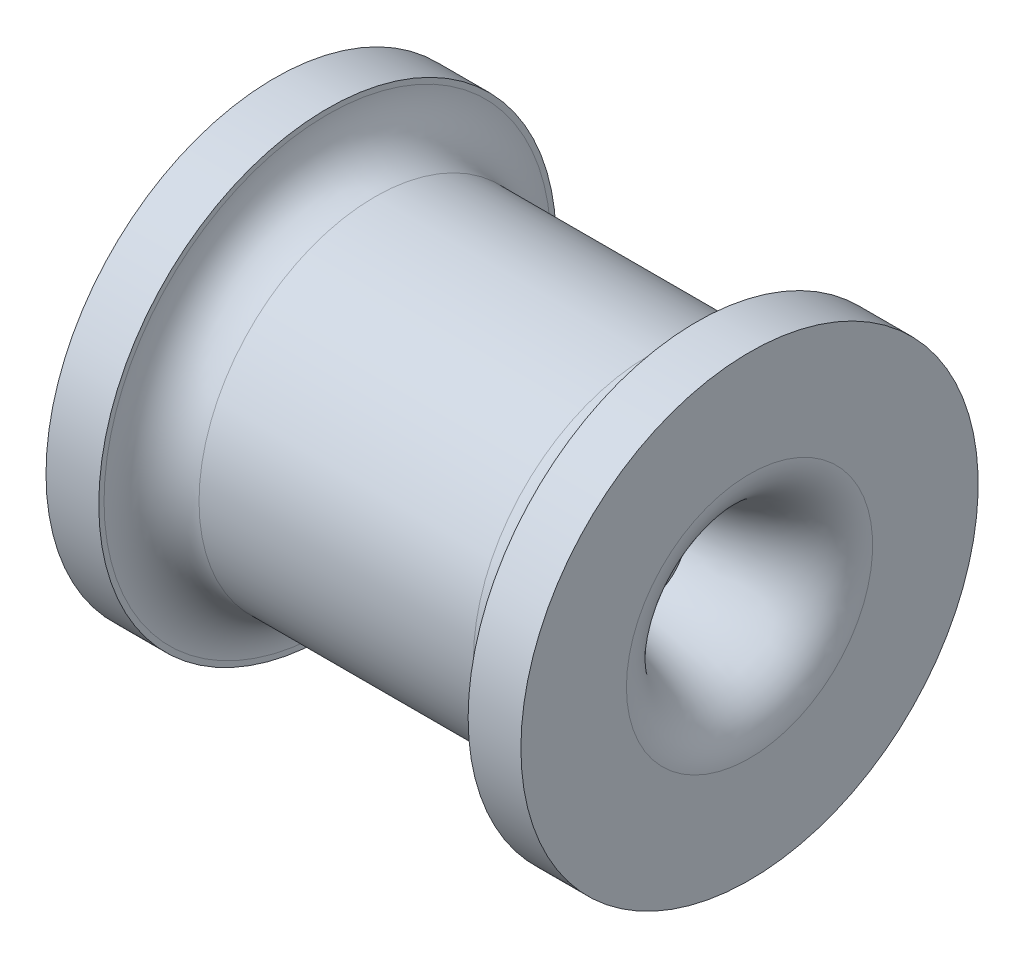
ISO-10303-21;
HEADER;
FILE_DESCRIPTION(('STEP AP214'),'2;1');
FILE_NAME('part.step','',(''),(''),'','','');
FILE_SCHEMA(('AUTOMOTIVE_DESIGN { 1 0 10303 214 1 1 1 1 }'));
ENDSEC;
DATA;
#1=APPLICATION_CONTEXT('core data for automotive mechanical design processes');
#2=APPLICATION_PROTOCOL_DEFINITION('international standard','automotive_design',2000,#1);
#3=PRODUCT_CONTEXT('',#1,'mechanical');
#4=PRODUCT('Part','Part','',(#3));
#5=PRODUCT_RELATED_PRODUCT_CATEGORY('part','',(#4));
#6=PRODUCT_DEFINITION_FORMATION('','',#4);
#7=PRODUCT_DEFINITION_CONTEXT('part definition',#1,'design');
#8=PRODUCT_DEFINITION('design','',#6,#7);
#9=PRODUCT_DEFINITION_SHAPE('','',#8);
#10=(LENGTH_UNIT() NAMED_UNIT(*) SI_UNIT(.MILLI.,.METRE.));
#11=(NAMED_UNIT(*) PLANE_ANGLE_UNIT() SI_UNIT($,.RADIAN.));
#12=(NAMED_UNIT(*) SI_UNIT($,.STERADIAN.) SOLID_ANGLE_UNIT());
#13=UNCERTAINTY_MEASURE_WITH_UNIT(LENGTH_MEASURE(1.E-05),#10,'distance_accuracy_value','');
#14=(GEOMETRIC_REPRESENTATION_CONTEXT(3) GLOBAL_UNCERTAINTY_ASSIGNED_CONTEXT((#13)) GLOBAL_UNIT_ASSIGNED_CONTEXT((#10,
#11,#12)) REPRESENTATION_CONTEXT('',''));
#15=CARTESIAN_POINT('',(0.,0.,0.));
#16=DIRECTION('',(0.,0.,1.));
#17=DIRECTION('',(1.,0.,0.));
#18=AXIS2_PLACEMENT_3D('',#15,#16,#17);
#19=CARTESIAN_POINT('',(0.,9.,0.));
#20=CARTESIAN_POINT('',(5.161431789987,9.07920685323501,0.));
#21=CARTESIAN_POINT('',(54.,9.38370308078967,0.));
#22=CARTESIAN_POINT('',(54.,28.,0.));
#23=B_SPLINE_CURVE_WITH_KNOTS('',3,(#19,#20,#21,#22),.UNSPECIFIED.,.F.,.F.,(4,4),(0.,1.),.UNSPECIFIED.);
#24=CARTESIAN_POINT('',(0.,0.,0.));
#25=DIRECTION('',(-1.,0.,0.));
#26=AXIS1_PLACEMENT('',#24,#25);
#27=SURFACE_OF_REVOLUTION('',#23,#26);
#28=CARTESIAN_POINT('',(54.,0.,0.));
#29=DIRECTION('',(-1.,0.,0.));
#30=DIRECTION('',(0.,0.,1.));
#31=AXIS2_PLACEMENT_3D('',#28,#29,#30);
#32=CIRCLE('',#31,28.);
#33=CARTESIAN_POINT('',(54.,0.,28.));
#34=VERTEX_POINT('',#33);
#35=EDGE_CURVE('E47',#34,#34,#32,.T.);
#36=ORIENTED_EDGE('',*,*,#35,.F.);
#37=EDGE_LOOP('',(#36));
#38=FACE_BOUND('',#37,.T.);
#39=CARTESIAN_POINT('',(26.,0.,0.));
#40=DIRECTION('',(-1.,0.,0.));
#41=DIRECTION('',(0.,0.,1.));
#42=AXIS2_PLACEMENT_3D('',#39,#40,#41);
#43=CIRCLE('',#42,11.037807832543);
#44=CARTESIAN_POINT('',(26.,0.,11.037807832543));
#45=VERTEX_POINT('',#44);
#46=EDGE_CURVE('E43',#45,#45,#43,.F.);
#47=ORIENTED_EDGE('',*,*,#46,.F.);
#48=EDGE_LOOP('',(#47));
#49=FACE_BOUND('',#48,.T.);
#50=ADVANCED_FACE('F32',(#38,#49),#27,.T.);
#51=CARTESIAN_POINT('',(54.,28.,0.));
#52=DIRECTION('',(-1.,0.,0.));
#53=DIRECTION('',(0.,0.,1.));
#54=AXIS2_PLACEMENT_3D('',#51,#52,#53);
#55=PLANE('',#54);
#56=CARTESIAN_POINT('',(54.,0.,0.));
#57=DIRECTION('',(-1.,0.,0.));
#58=DIRECTION('',(0.,0.,1.));
#59=AXIS2_PLACEMENT_3D('',#56,#57,#58);
#60=CIRCLE('',#59,52.);
#61=CARTESIAN_POINT('',(54.,0.,52.));
#62=VERTEX_POINT('',#61);
#63=EDGE_CURVE('E52',#62,#62,#60,.T.);
#64=ORIENTED_EDGE('',*,*,#63,.F.);
#65=EDGE_LOOP('',(#64));
#66=FACE_BOUND('',#65,.T.);
#67=ORIENTED_EDGE('',*,*,#35,.T.);
#68=EDGE_LOOP('',(#67));
#69=FACE_BOUND('',#68,.T.);
#70=ADVANCED_FACE('F140',(#66,#69),#55,.F.);
#71=CARTESIAN_POINT('',(0.,0.,0.));
#72=DIRECTION('',(-1.,0.,0.));
#73=DIRECTION('',(0.,0.,1.));
#74=AXIS2_PLACEMENT_3D('',#71,#72,#73);
#75=CYLINDRICAL_SURFACE('',#74,52.);
#76=CARTESIAN_POINT('',(42.,0.,0.));
#77=DIRECTION('',(-1.,0.,0.));
#78=DIRECTION('',(0.,0.,1.));
#79=AXIS2_PLACEMENT_3D('',#76,#77,#78);
#80=CIRCLE('',#79,52.);
#81=CARTESIAN_POINT('',(42.,0.,52.));
#82=VERTEX_POINT('',#81);
#83=EDGE_CURVE('E55',#82,#82,#80,.T.);
#84=ORIENTED_EDGE('',*,*,#83,.F.);
#85=EDGE_LOOP('',(#84));
#86=FACE_BOUND('',#85,.T.);
#87=ORIENTED_EDGE('',*,*,#63,.T.);
#88=EDGE_LOOP('',(#87));
#89=FACE_BOUND('',#88,.T.);
#90=ADVANCED_FACE('F136',(#86,#89),#75,.T.);
#91=CARTESIAN_POINT('',(42.,52.,0.));
#92=DIRECTION('',(1.,0.,0.));
#93=DIRECTION('',(0.,0.,-1.));
#94=AXIS2_PLACEMENT_3D('',#91,#92,#93);
#95=PLANE('',#94);
#96=CARTESIAN_POINT('',(42.,0.,0.));
#97=DIRECTION('',(-1.,0.,0.));
#98=DIRECTION('',(0.,0.,1.));
#99=AXIS2_PLACEMENT_3D('',#96,#97,#98);
#100=CIRCLE('',#99,50.8);
#101=CARTESIAN_POINT('',(42.,0.,50.8));
#102=VERTEX_POINT('',#101);
#103=EDGE_CURVE('E58',#102,#102,#100,.T.);
#104=ORIENTED_EDGE('',*,*,#103,.F.);
#105=EDGE_LOOP('',(#104));
#106=FACE_BOUND('',#105,.T.);
#107=ORIENTED_EDGE('',*,*,#83,.T.);
#108=EDGE_LOOP('',(#107));
#109=FACE_BOUND('',#108,.T.);
#110=ADVANCED_FACE('F132',(#106,#109),#95,.F.);
#111=CARTESIAN_POINT('',(31.2,0.,0.));
#112=DIRECTION('',(-1.,0.,0.));
#113=DIRECTION('',(0.,0.,1.));
#114=AXIS2_PLACEMENT_3D('',#111,#112,#113);
#115=TOROIDAL_SURFACE('',#114,50.8,10.8);
#116=CARTESIAN_POINT('',(31.2,0.,0.));
#117=DIRECTION('',(-1.,0.,0.));
#118=DIRECTION('',(0.,0.,1.));
#119=AXIS2_PLACEMENT_3D('',#116,#117,#118);
#120=CIRCLE('',#119,40.);
#121=CARTESIAN_POINT('',(31.2,0.,40.));
#122=VERTEX_POINT('',#121);
#123=EDGE_CURVE('E61',#122,#122,#120,.T.);
#124=ORIENTED_EDGE('',*,*,#123,.F.);
#125=EDGE_LOOP('',(#124));
#126=FACE_BOUND('',#125,.T.);
#127=ORIENTED_EDGE('',*,*,#103,.T.);
#128=EDGE_LOOP('',(#127));
#129=FACE_BOUND('',#128,.T.);
#130=ADVANCED_FACE('F128',(#126,#129),#115,.F.);
#131=CARTESIAN_POINT('',(0.,0.,0.));
#132=DIRECTION('',(-1.,0.,0.));
#133=DIRECTION('',(0.,0.,1.));
#134=AXIS2_PLACEMENT_3D('',#131,#132,#133);
#135=CYLINDRICAL_SURFACE('',#134,40.);
#136=CARTESIAN_POINT('',(-31.2,0.,0.));
#137=DIRECTION('',(-1.,0.,0.));
#138=DIRECTION('',(0.,0.,1.));
#139=AXIS2_PLACEMENT_3D('',#136,#137,#138);
#140=CIRCLE('',#139,40.);
#141=CARTESIAN_POINT('',(-31.2,0.,40.));
#142=VERTEX_POINT('',#141);
#143=EDGE_CURVE('E64',#142,#142,#140,.T.);
#144=ORIENTED_EDGE('',*,*,#143,.F.);
#145=EDGE_LOOP('',(#144));
#146=FACE_BOUND('',#145,.T.);
#147=ORIENTED_EDGE('',*,*,#123,.T.);
#148=EDGE_LOOP('',(#147));
#149=FACE_BOUND('',#148,.T.);
#150=ADVANCED_FACE('F124',(#146,#149),#135,.T.);
#151=CARTESIAN_POINT('',(-31.2,0.,0.));
#152=DIRECTION('',(-1.,0.,0.));
#153=DIRECTION('',(0.,0.,1.));
#154=AXIS2_PLACEMENT_3D('',#151,#152,#153);
#155=TOROIDAL_SURFACE('',#154,50.8,10.8);
#156=CARTESIAN_POINT('',(-42.,0.,0.));
#157=DIRECTION('',(-1.,0.,0.));
#158=DIRECTION('',(0.,0.,1.));
#159=AXIS2_PLACEMENT_3D('',#156,#157,#158);
#160=CIRCLE('',#159,50.8);
#161=CARTESIAN_POINT('',(-42.,0.,50.8));
#162=VERTEX_POINT('',#161);
#163=EDGE_CURVE('E67',#162,#162,#160,.T.);
#164=ORIENTED_EDGE('',*,*,#163,.F.);
#165=EDGE_LOOP('',(#164));
#166=FACE_BOUND('',#165,.T.);
#167=ORIENTED_EDGE('',*,*,#143,.T.);
#168=EDGE_LOOP('',(#167));
#169=FACE_BOUND('',#168,.T.);
#170=ADVANCED_FACE('F120',(#166,#169),#155,.F.);
#171=CARTESIAN_POINT('',(-42.,52.,0.));
#172=DIRECTION('',(-1.,0.,0.));
#173=DIRECTION('',(0.,0.,1.));
#174=AXIS2_PLACEMENT_3D('',#171,#172,#173);
#175=PLANE('',#174);
#176=CARTESIAN_POINT('',(-42.,0.,0.));
#177=DIRECTION('',(-1.,0.,0.));
#178=DIRECTION('',(0.,0.,1.));
#179=AXIS2_PLACEMENT_3D('',#176,#177,#178);
#180=CIRCLE('',#179,52.);
#181=CARTESIAN_POINT('',(-42.,0.,52.));
#182=VERTEX_POINT('',#181);
#183=EDGE_CURVE('E70',#182,#182,#180,.T.);
#184=ORIENTED_EDGE('',*,*,#183,.F.);
#185=EDGE_LOOP('',(#184));
#186=FACE_BOUND('',#185,.T.);
#187=ORIENTED_EDGE('',*,*,#163,.T.);
#188=EDGE_LOOP('',(#187));
#189=FACE_BOUND('',#188,.T.);
#190=ADVANCED_FACE('F116',(#186,#189),#175,.F.);
#191=CARTESIAN_POINT('',(0.,0.,0.));
#192=DIRECTION('',(-1.,0.,0.));
#193=DIRECTION('',(0.,0.,1.));
#194=AXIS2_PLACEMENT_3D('',#191,#192,#193);
#195=CYLINDRICAL_SURFACE('',#194,52.);
#196=CARTESIAN_POINT('',(-54.,0.,0.));
#197=DIRECTION('',(-1.,0.,0.));
#198=DIRECTION('',(0.,0.,1.));
#199=AXIS2_PLACEMENT_3D('',#196,#197,#198);
#200=CIRCLE('',#199,52.);
#201=CARTESIAN_POINT('',(-54.,0.,52.));
#202=VERTEX_POINT('',#201);
#203=EDGE_CURVE('E73',#202,#202,#200,.T.);
#204=ORIENTED_EDGE('',*,*,#203,.F.);
#205=EDGE_LOOP('',(#204));
#206=FACE_BOUND('',#205,.T.);
#207=ORIENTED_EDGE('',*,*,#183,.T.);
#208=EDGE_LOOP('',(#207));
#209=FACE_BOUND('',#208,.T.);
#210=ADVANCED_FACE('F112',(#206,#209),#195,.T.);
#211=CARTESIAN_POINT('',(-54.,28.,0.));
#212=DIRECTION('',(1.,0.,0.));
#213=DIRECTION('',(0.,0.,-1.));
#214=AXIS2_PLACEMENT_3D('',#211,#212,#213);
#215=PLANE('',#214);
#216=CARTESIAN_POINT('',(-54.,0.,0.));
#217=DIRECTION('',(-1.,0.,0.));
#218=DIRECTION('',(0.,0.,1.));
#219=AXIS2_PLACEMENT_3D('',#216,#217,#218);
#220=CIRCLE('',#219,28.);
#221=CARTESIAN_POINT('',(-54.,0.,28.));
#222=VERTEX_POINT('',#221);
#223=EDGE_CURVE('E76',#222,#222,#220,.T.);
#224=ORIENTED_EDGE('',*,*,#223,.F.);
#225=EDGE_LOOP('',(#224));
#226=FACE_BOUND('',#225,.T.);
#227=ORIENTED_EDGE('',*,*,#203,.T.);
#228=EDGE_LOOP('',(#227));
#229=FACE_BOUND('',#228,.T.);
#230=ADVANCED_FACE('F108',(#226,#229),#215,.F.);
#231=CARTESIAN_POINT('',(0.,0.,0.));
#232=DIRECTION('',(-1.,0.,0.));
#233=DIRECTION('',(0.,0.,1.));
#234=AXIS2_PLACEMENT_3D('',#231,#232,#233);
#235=CYLINDRICAL_SURFACE('',#234,28.);
#236=CARTESIAN_POINT('',(42.,0.,0.));
#237=DIRECTION('',(-1.,0.,0.));
#238=DIRECTION('',(0.,0.,1.));
#239=AXIS2_PLACEMENT_3D('',#236,#237,#238);
#240=CIRCLE('',#239,28.);
#241=CARTESIAN_POINT('',(42.,0.,28.));
#242=VERTEX_POINT('',#241);
#243=EDGE_CURVE('E79',#242,#242,#240,.T.);
#244=ORIENTED_EDGE('',*,*,#243,.F.);
#245=EDGE_LOOP('',(#244));
#246=FACE_BOUND('',#245,.T.);
#247=ORIENTED_EDGE('',*,*,#223,.T.);
#248=EDGE_LOOP('',(#247));
#249=FACE_BOUND('',#248,.T.);
#250=ADVANCED_FACE('F103',(#246,#249),#235,.F.);
#251=CARTESIAN_POINT('',(42.3826919635112,28.3084264299482,0.));
#252=CARTESIAN_POINT('',(42.3261095941627,28.2584685277757,0.));
#253=CARTESIAN_POINT('',(42.2200181109537,28.1688487967992,0.));
#254=CARTESIAN_POINT('',(41.924266442218,27.9385127670662,0.));
#255=CARTESIAN_POINT('',(41.4472123817567,27.6090343966881,0.));
#256=CARTESIAN_POINT('',(40.6909691652816,27.1605282149419,0.));
#257=CARTESIAN_POINT('',(39.4577764110207,26.5261976159612,0.));
#258=CARTESIAN_POINT('',(37.5270190568906,25.7083103321757,0.));
#259=CARTESIAN_POINT('',(34.7141341261184,24.7779281655331,0.));
#260=CARTESIAN_POINT('',(31.5284785658682,23.9420342994505,0.));
#261=CARTESIAN_POINT('',(26.9343751037724,22.9787033983721,0.));
#262=CARTESIAN_POINT('',(20.8051670007676,22.0727788571338,0.));
#263=CARTESIAN_POINT('',(14.7900806989775,21.5269247466971,0.));
#264=CARTESIAN_POINT('',(10.3900597953006,21.2576119139242,0.));
#265=CARTESIAN_POINT('',(7.37824552701222,21.125442102078,0.));
#266=CARTESIAN_POINT('',(4.7347835433789,21.0487128171063,0.));
#267=CARTESIAN_POINT('',(2.90417939336577,21.0185863887907,0.));
#268=CARTESIAN_POINT('',(1.69657238972521,21.0072251231811,0.));
#269=CARTESIAN_POINT('',(0.929954604083629,21.0031985871177,0.));
#270=CARTESIAN_POINT('',(0.290053628729902,21.0017251275947,0.));
#271=CARTESIAN_POINT('',(-0.0168887451053814,21.0013447026871,0.));
#272=CARTESIAN_POINT('',(-0.185316447760478,21.00079474029,0.));
#273=B_SPLINE_CURVE_WITH_KNOTS('',3,(#251,#252,#253,#254,#255,#256,#257,#258,#259,#260,#261,
#262,#263,#264,#265,#266,#267,#268,#269,#270,#271,#272),.UNSPECIFIED.,.F.,.F.,(4,1,1,1,1,1,1,1,
1,1,1,1,1,1,1,1,1,1,1,4),(0.17344216580841,0.186357131967653,0.199272098126897,
0.225102030445384,0.250931962763871,0.276761895082359,0.328421759719333,0.380081624356307,
0.431741488993282,0.483401353630256,0.586721082904205,0.690040812178154,0.741700676815128,
0.793360541452102,0.845020406089077,0.896680270726051,0.922510203044538,0.948340135363026,
0.974170067681513,1.),.UNSPECIFIED.);
#274=CARTESIAN_POINT('',(0.,0.,0.));
#275=DIRECTION('',(-1.,0.,0.));
#276=AXIS1_PLACEMENT('',#274,#275);
#277=SURFACE_OF_REVOLUTION('',#273,#276);
#278=CARTESIAN_POINT('',(0.,0.,0.));
#279=DIRECTION('',(-1.,0.,0.));
#280=DIRECTION('',(0.,0.,1.));
#281=AXIS2_PLACEMENT_3D('',#278,#279,#280);
#282=CIRCLE('',#281,21.0012881085249);
#283=CARTESIAN_POINT('',(0.,0.,21.0012881085249));
#284=VERTEX_POINT('',#283);
#285=EDGE_CURVE('E82',#284,#284,#282,.T.);
#286=ORIENTED_EDGE('',*,*,#285,.F.);
#287=EDGE_LOOP('',(#286));
#288=FACE_BOUND('',#287,.T.);
#289=ORIENTED_EDGE('',*,*,#243,.T.);
#290=EDGE_LOOP('',(#289));
#291=FACE_BOUND('',#290,.T.);
#292=ADVANCED_FACE('F98',(#288,#291),#277,.T.);
#293=CARTESIAN_POINT('',(26.,0.,0.));
#294=DIRECTION('',(-1.,0.,0.));
#295=DIRECTION('',(0.,0.,1.));
#296=AXIS2_PLACEMENT_3D('',#293,#294,#295);
#297=CYLINDRICAL_SURFACE('',#296,21.0012881085249);
#298=CARTESIAN_POINT('',(-54.,0.,0.));
#299=DIRECTION('',(-1.,0.,0.));
#300=DIRECTION('',(0.,0.,1.));
#301=AXIS2_PLACEMENT_3D('',#298,#299,#300);
#302=CIRCLE('',#301,21.0012881085249);
#303=CARTESIAN_POINT('',(-54.,0.,21.0012881085249));
#304=VERTEX_POINT('',#303);
#305=EDGE_CURVE('E85',#304,#304,#302,.T.);
#306=ORIENTED_EDGE('',*,*,#305,.F.);
#307=EDGE_LOOP('',(#306));
#308=FACE_BOUND('',#307,.T.);
#309=ORIENTED_EDGE('',*,*,#285,.T.);
#310=EDGE_LOOP('',(#309));
#311=FACE_BOUND('',#310,.T.);
#312=ADVANCED_FACE('F102',(#308,#311),#297,.T.);
#313=CARTESIAN_POINT('',(26.,0.,0.));
#314=DIRECTION('',(-1.,0.,0.));
#315=DIRECTION('',(0.,0.,1.));
#316=AXIS2_PLACEMENT_3D('',#313,#314,#315);
#317=CYLINDRICAL_SURFACE('',#316,9.);
#318=CARTESIAN_POINT('',(-54.,0.,0.));
#319=DIRECTION('',(-1.,0.,0.));
#320=DIRECTION('',(0.,0.,1.));
#321=AXIS2_PLACEMENT_3D('',#318,#319,#320);
#322=CIRCLE('',#321,9.);
#323=CARTESIAN_POINT('',(-54.,0.,9.));
#324=VERTEX_POINT('',#323);
#325=EDGE_CURVE('E176',#324,#324,#322,.T.);
#326=ORIENTED_EDGE('',*,*,#325,.T.);
#327=EDGE_LOOP('',(#326));
#328=FACE_BOUND('',#327,.T.);
#329=CARTESIAN_POINT('',(26.,0.,0.));
#330=DIRECTION('',(-1.,0.,0.));
#331=DIRECTION('',(0.,0.,1.));
#332=AXIS2_PLACEMENT_3D('',#329,#330,#331);
#333=CIRCLE('',#332,9.);
#334=CARTESIAN_POINT('',(26.,0.,9.));
#335=VERTEX_POINT('',#334);
#336=EDGE_CURVE('E180',#335,#335,#333,.T.);
#337=ORIENTED_EDGE('',*,*,#336,.F.);
#338=EDGE_LOOP('',(#337));
#339=FACE_BOUND('',#338,.T.);
#340=ADVANCED_FACE('F166',(#328,#339),#317,.F.);
#341=CARTESIAN_POINT('',(-54.,0.,0.));
#342=DIRECTION('',(-1.,0.,0.));
#343=DIRECTION('',(0.,0.,1.));
#344=AXIS2_PLACEMENT_3D('',#341,#342,#343);
#345=PLANE('',#344);
#346=ORIENTED_EDGE('',*,*,#325,.F.);
#347=EDGE_LOOP('',(#346));
#348=FACE_BOUND('',#347,.T.);
#349=ORIENTED_EDGE('',*,*,#305,.T.);
#350=EDGE_LOOP('',(#349));
#351=FACE_BOUND('',#350,.T.);
#352=ADVANCED_FACE('F162',(#348,#351),#345,.T.);
#353=CARTESIAN_POINT('',(26.,0.,0.));
#354=DIRECTION('',(1.,0.,0.));
#355=DIRECTION('',(0.,0.,-1.));
#356=AXIS2_PLACEMENT_3D('',#353,#354,#355);
#357=PLANE('',#356);
#358=ORIENTED_EDGE('',*,*,#336,.T.);
#359=EDGE_LOOP('',(#358));
#360=FACE_BOUND('',#359,.T.);
#361=ADVANCED_FACE('F155',(#360),#357,.F.);
#362=CARTESIAN_POINT('',(31.,0.,0.));
#363=DIRECTION('',(-1.,0.,0.));
#364=DIRECTION('',(0.,0.,1.));
#365=AXIS2_PLACEMENT_3D('',#362,#363,#364);
#366=CYLINDRICAL_SURFACE('',#365,11.037807832543);
#367=CARTESIAN_POINT('',(27.,0.,0.));
#368=DIRECTION('',(1.,0.,0.));
#369=DIRECTION('',(0.,0.,-1.));
#370=AXIS2_PLACEMENT_3D('',#367,#368,#369);
#371=CIRCLE('',#370,11.037807832543);
#372=CARTESIAN_POINT('',(27.,0.,-11.037807832543));
#373=VERTEX_POINT('',#372);
#374=EDGE_CURVE('E10',#373,#373,#371,.F.);
#375=ORIENTED_EDGE('',*,*,#374,.T.);
#376=EDGE_LOOP('',(#375));
#377=FACE_BOUND('',#376,.T.);
#378=ORIENTED_EDGE('',*,*,#46,.T.);
#379=EDGE_LOOP('',(#378));
#380=FACE_BOUND('',#379,.T.);
#381=ADVANCED_FACE('F152',(#377,#380),#366,.T.);
#382=CARTESIAN_POINT('',(31.,0.,0.));
#383=DIRECTION('',(1.,0.,0.));
#384=DIRECTION('',(0.,0.,-1.));
#385=AXIS2_PLACEMENT_3D('',#382,#383,#384);
#386=PLANE('',#385);
#387=CARTESIAN_POINT('',(31.,0.,0.));
#388=DIRECTION('',(1.,0.,0.));
#389=DIRECTION('',(0.,0.,-1.));
#390=AXIS2_PLACEMENT_3D('',#387,#388,#389);
#391=CIRCLE('',#390,7.03780783254302);
#392=CARTESIAN_POINT('',(31.,0.,-7.03780783254302));
#393=VERTEX_POINT('',#392);
#394=EDGE_CURVE('E39',#393,#393,#391,.T.);
#395=ORIENTED_EDGE('',*,*,#394,.T.);
#396=EDGE_LOOP('',(#395));
#397=FACE_BOUND('',#396,.T.);
#398=ADVANCED_FACE('F154',(#397),#386,.T.);
#399=CARTESIAN_POINT('',(27.,0.,0.));
#400=DIRECTION('',(1.,0.,0.));
#401=DIRECTION('',(0.,0.,-1.));
#402=AXIS2_PLACEMENT_3D('',#399,#400,#401);
#403=TOROIDAL_SURFACE('',#402,7.03780783254302,4.);
#404=ORIENTED_EDGE('',*,*,#374,.F.);
#405=EDGE_LOOP('',(#404));
#406=FACE_BOUND('',#405,.T.);
#407=ORIENTED_EDGE('',*,*,#394,.F.);
#408=EDGE_LOOP('',(#407));
#409=FACE_BOUND('',#408,.T.);
#410=ADVANCED_FACE('F34',(#406,#409),#403,.T.);
#411=CLOSED_SHELL('',(#50,#70,#90,#110,#130,#150,#170,#190,#210,#230,#250,#292,#312,#340,#352,
#361,#381,#398,#410));
#412=MANIFOLD_SOLID_BREP('B2',#411);
#413=ADVANCED_BREP_SHAPE_REPRESENTATION('',(#18,#412),#14);
#414=SHAPE_DEFINITION_REPRESENTATION(#9,#413);
ENDSEC;
END-ISO-10303-21;
